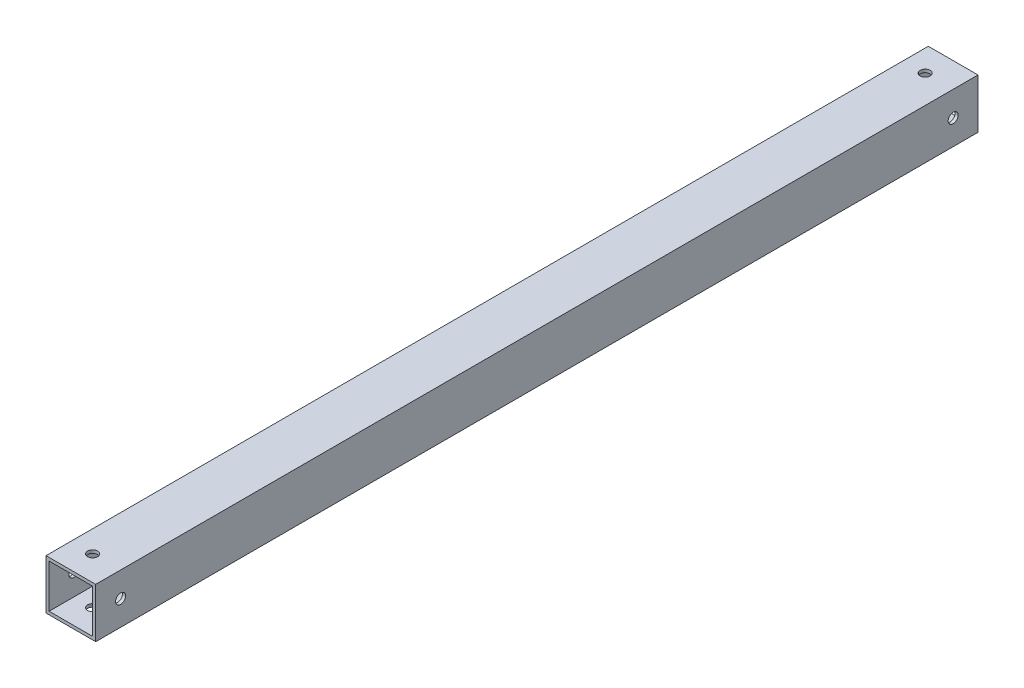
ISO-10303-21;
HEADER;
FILE_DESCRIPTION(('STEP AP214'),'2;1');
FILE_NAME('part.step','',(''),(''),'','','');
FILE_SCHEMA(('AUTOMOTIVE_DESIGN { 1 0 10303 214 1 1 1 1 }'));
ENDSEC;
DATA;
#1=APPLICATION_CONTEXT('core data for automotive mechanical design processes');
#2=APPLICATION_PROTOCOL_DEFINITION('international standard','automotive_design',2000,#1);
#3=PRODUCT_CONTEXT('',#1,'mechanical');
#4=PRODUCT('Part','Part','',(#3));
#5=PRODUCT_RELATED_PRODUCT_CATEGORY('part','',(#4));
#6=PRODUCT_DEFINITION_FORMATION('','',#4);
#7=PRODUCT_DEFINITION_CONTEXT('part definition',#1,'design');
#8=PRODUCT_DEFINITION('design','',#6,#7);
#9=PRODUCT_DEFINITION_SHAPE('','',#8);
#10=(LENGTH_UNIT() NAMED_UNIT(*) SI_UNIT(.MILLI.,.METRE.));
#11=(NAMED_UNIT(*) PLANE_ANGLE_UNIT() SI_UNIT($,.RADIAN.));
#12=(NAMED_UNIT(*) SI_UNIT($,.STERADIAN.) SOLID_ANGLE_UNIT());
#13=UNCERTAINTY_MEASURE_WITH_UNIT(LENGTH_MEASURE(1.E-05),#10,'distance_accuracy_value','');
#14=(GEOMETRIC_REPRESENTATION_CONTEXT(3) GLOBAL_UNCERTAINTY_ASSIGNED_CONTEXT((#13)) GLOBAL_UNIT_ASSIGNED_CONTEXT((#10,
#11,#12)) REPRESENTATION_CONTEXT('',''));
#15=CARTESIAN_POINT('',(0.,0.,0.));
#16=DIRECTION('',(0.,0.,1.));
#17=DIRECTION('',(1.,0.,0.));
#18=AXIS2_PLACEMENT_3D('',#15,#16,#17);
#19=CARTESIAN_POINT('',(0.,0.,450.85));
#20=DIRECTION('',(0.,0.,-1.));
#21=DIRECTION('',(-1.,0.,0.));
#22=AXIS2_PLACEMENT_3D('',#19,#20,#21);
#23=PLANE('',#22);
#24=DIRECTION('',(0.,-1.,0.));
#25=VECTOR('',#24,1.);
#26=CARTESIAN_POINT('',(0.,0.,450.85));
#27=LINE('',#26,#25);
#28=CARTESIAN_POINT('',(0.,25.4,450.85));
#29=VERTEX_POINT('',#28);
#30=CARTESIAN_POINT('',(0.,0.,450.85));
#31=VERTEX_POINT('',#30);
#32=EDGE_CURVE('E156',#29,#31,#27,.T.);
#33=ORIENTED_EDGE('',*,*,#32,.T.);
#34=DIRECTION('',(1.,0.,0.));
#35=VECTOR('',#34,1.);
#36=CARTESIAN_POINT('',(0.,0.,450.85));
#37=LINE('',#36,#35);
#38=CARTESIAN_POINT('',(25.4,0.,450.85));
#39=VERTEX_POINT('',#38);
#40=EDGE_CURVE('E160',#31,#39,#37,.T.);
#41=ORIENTED_EDGE('',*,*,#40,.T.);
#42=DIRECTION('',(0.,1.,0.));
#43=VECTOR('',#42,1.);
#44=CARTESIAN_POINT('',(25.4,0.,450.85));
#45=LINE('',#44,#43);
#46=CARTESIAN_POINT('',(25.4,25.4,450.85));
#47=VERTEX_POINT('',#46);
#48=EDGE_CURVE('E164',#39,#47,#45,.T.);
#49=ORIENTED_EDGE('',*,*,#48,.T.);
#50=DIRECTION('',(-1.,0.,0.));
#51=VECTOR('',#50,1.);
#52=CARTESIAN_POINT('',(0.,25.4,450.85));
#53=LINE('',#52,#51);
#54=EDGE_CURVE('E167',#47,#29,#53,.T.);
#55=ORIENTED_EDGE('',*,*,#54,.T.);
#56=EDGE_LOOP('',(#33,#41,#49,#55));
#57=FACE_BOUND('',#56,.T.);
#58=DIRECTION('',(0.,-1.,0.));
#59=VECTOR('',#58,1.);
#60=CARTESIAN_POINT('',(1.5875,1.5875,450.85));
#61=LINE('',#60,#59);
#62=CARTESIAN_POINT('',(1.5875,23.8125,450.85));
#63=VERTEX_POINT('',#62);
#64=CARTESIAN_POINT('',(1.5875,1.5875,450.85));
#65=VERTEX_POINT('',#64);
#66=EDGE_CURVE('E106',#63,#65,#61,.T.);
#67=ORIENTED_EDGE('',*,*,#66,.F.);
#68=DIRECTION('',(-1.,0.,0.));
#69=VECTOR('',#68,1.);
#70=CARTESIAN_POINT('',(1.5875,23.8125,450.85));
#71=LINE('',#70,#69);
#72=CARTESIAN_POINT('',(23.8125,23.8125,450.85));
#73=VERTEX_POINT('',#72);
#74=EDGE_CURVE('E132',#73,#63,#71,.T.);
#75=ORIENTED_EDGE('',*,*,#74,.F.);
#76=DIRECTION('',(0.,1.,0.));
#77=VECTOR('',#76,1.);
#78=CARTESIAN_POINT('',(23.8125,1.5875,450.85));
#79=LINE('',#78,#77);
#80=CARTESIAN_POINT('',(23.8125,1.5875,450.85));
#81=VERTEX_POINT('',#80);
#82=EDGE_CURVE('E128',#81,#73,#79,.T.);
#83=ORIENTED_EDGE('',*,*,#82,.F.);
#84=DIRECTION('',(1.,0.,0.));
#85=VECTOR('',#84,1.);
#86=CARTESIAN_POINT('',(1.5875,1.5875,450.85));
#87=LINE('',#86,#85);
#88=EDGE_CURVE('E115',#65,#81,#87,.T.);
#89=ORIENTED_EDGE('',*,*,#88,.F.);
#90=EDGE_LOOP('',(#67,#75,#83,#89));
#91=FACE_BOUND('',#90,.T.);
#92=ADVANCED_FACE('F38',(#57,#91),#23,.F.);
#93=CARTESIAN_POINT('',(0.,0.,0.));
#94=DIRECTION('',(0.,0.,-1.));
#95=DIRECTION('',(-1.,0.,0.));
#96=AXIS2_PLACEMENT_3D('',#93,#94,#95);
#97=PLANE('',#96);
#98=DIRECTION('',(0.,-1.,0.));
#99=VECTOR('',#98,1.);
#100=CARTESIAN_POINT('',(0.,0.,0.));
#101=LINE('',#100,#99);
#102=CARTESIAN_POINT('',(0.,25.4,0.));
#103=VERTEX_POINT('',#102);
#104=CARTESIAN_POINT('',(0.,0.,0.));
#105=VERTEX_POINT('',#104);
#106=EDGE_CURVE('E124',#103,#105,#101,.T.);
#107=ORIENTED_EDGE('',*,*,#106,.F.);
#108=DIRECTION('',(-1.,0.,0.));
#109=VECTOR('',#108,1.);
#110=CARTESIAN_POINT('',(0.,25.4,0.));
#111=LINE('',#110,#109);
#112=CARTESIAN_POINT('',(25.4,25.4,0.));
#113=VERTEX_POINT('',#112);
#114=EDGE_CURVE('E161',#113,#103,#111,.T.);
#115=ORIENTED_EDGE('',*,*,#114,.F.);
#116=DIRECTION('',(0.,1.,0.));
#117=VECTOR('',#116,1.);
#118=CARTESIAN_POINT('',(25.4,0.,0.));
#119=LINE('',#118,#117);
#120=CARTESIAN_POINT('',(25.4,0.,0.));
#121=VERTEX_POINT('',#120);
#122=EDGE_CURVE('E177',#121,#113,#119,.T.);
#123=ORIENTED_EDGE('',*,*,#122,.F.);
#124=DIRECTION('',(1.,0.,0.));
#125=VECTOR('',#124,1.);
#126=CARTESIAN_POINT('',(0.,0.,0.));
#127=LINE('',#126,#125);
#128=EDGE_CURVE('E174',#105,#121,#127,.T.);
#129=ORIENTED_EDGE('',*,*,#128,.F.);
#130=EDGE_LOOP('',(#107,#115,#123,#129));
#131=FACE_BOUND('',#130,.T.);
#132=DIRECTION('',(-1.,0.,0.));
#133=VECTOR('',#132,1.);
#134=CARTESIAN_POINT('',(1.5875,23.8125,0.));
#135=LINE('',#134,#133);
#136=CARTESIAN_POINT('',(23.8125,23.8125,0.));
#137=VERTEX_POINT('',#136);
#138=CARTESIAN_POINT('',(1.5875,23.8125,0.));
#139=VERTEX_POINT('',#138);
#140=EDGE_CURVE('E116',#137,#139,#135,.T.);
#141=ORIENTED_EDGE('',*,*,#140,.T.);
#142=DIRECTION('',(0.,-1.,0.));
#143=VECTOR('',#142,1.);
#144=CARTESIAN_POINT('',(1.5875,1.5875,0.));
#145=LINE('',#144,#143);
#146=CARTESIAN_POINT('',(1.5875,1.5875,0.));
#147=VERTEX_POINT('',#146);
#148=EDGE_CURVE('E64',#139,#147,#145,.T.);
#149=ORIENTED_EDGE('',*,*,#148,.T.);
#150=DIRECTION('',(1.,0.,0.));
#151=VECTOR('',#150,1.);
#152=CARTESIAN_POINT('',(1.5875,1.5875,0.));
#153=LINE('',#152,#151);
#154=CARTESIAN_POINT('',(23.8125,1.5875,0.));
#155=VERTEX_POINT('',#154);
#156=EDGE_CURVE('E122',#147,#155,#153,.T.);
#157=ORIENTED_EDGE('',*,*,#156,.T.);
#158=DIRECTION('',(0.,1.,0.));
#159=VECTOR('',#158,1.);
#160=CARTESIAN_POINT('',(23.8125,1.5875,0.));
#161=LINE('',#160,#159);
#162=EDGE_CURVE('E143',#155,#137,#161,.T.);
#163=ORIENTED_EDGE('',*,*,#162,.T.);
#164=EDGE_LOOP('',(#141,#149,#157,#163));
#165=FACE_BOUND('',#164,.T.);
#166=ADVANCED_FACE('F274',(#131,#165),#97,.T.);
#167=CARTESIAN_POINT('',(0.,0.,450.85));
#168=DIRECTION('',(1.,0.,0.));
#169=DIRECTION('',(0.,0.,-1.));
#170=AXIS2_PLACEMENT_3D('',#167,#168,#169);
#171=PLANE('',#170);
#172=CARTESIAN_POINT('',(0.,12.7,438.15));
#173=DIRECTION('',(1.,0.,0.));
#174=DIRECTION('',(0.,0.,-1.));
#175=AXIS2_PLACEMENT_3D('',#172,#173,#174);
#176=CIRCLE('',#175,2.54000000000001);
#177=CARTESIAN_POINT('',(0.,12.7,435.61));
#178=VERTEX_POINT('',#177);
#179=EDGE_CURVE('E197',#178,#178,#176,.T.);
#180=ORIENTED_EDGE('',*,*,#179,.T.);
#181=EDGE_LOOP('',(#180));
#182=FACE_BOUND('',#181,.T.);
#183=CARTESIAN_POINT('',(0.,12.7,12.7));
#184=DIRECTION('',(1.,0.,0.));
#185=DIRECTION('',(0.,0.,1.));
#186=AXIS2_PLACEMENT_3D('',#183,#184,#185);
#187=CIRCLE('',#186,2.53999999999998);
#188=CARTESIAN_POINT('',(0.,12.7,15.24));
#189=VERTEX_POINT('',#188);
#190=EDGE_CURVE('E241',#189,#189,#187,.T.);
#191=ORIENTED_EDGE('',*,*,#190,.T.);
#192=EDGE_LOOP('',(#191));
#193=FACE_BOUND('',#192,.T.);
#194=ORIENTED_EDGE('',*,*,#106,.T.);
#195=DIRECTION('',(0.,0.,-1.));
#196=VECTOR('',#195,1.);
#197=CARTESIAN_POINT('',(0.,0.,450.85));
#198=LINE('',#197,#196);
#199=EDGE_CURVE('E11',#31,#105,#198,.T.);
#200=ORIENTED_EDGE('',*,*,#199,.F.);
#201=ORIENTED_EDGE('',*,*,#32,.F.);
#202=DIRECTION('',(0.,0.,-1.));
#203=VECTOR('',#202,1.);
#204=CARTESIAN_POINT('',(0.,25.4,450.85));
#205=LINE('',#204,#203);
#206=EDGE_CURVE('E170',#29,#103,#205,.T.);
#207=ORIENTED_EDGE('',*,*,#206,.T.);
#208=EDGE_LOOP('',(#194,#200,#201,#207));
#209=FACE_BOUND('',#208,.T.);
#210=ADVANCED_FACE('F40',(#182,#193,#209),#171,.F.);
#211=CARTESIAN_POINT('',(0.,0.,450.85));
#212=DIRECTION('',(0.,1.,0.));
#213=DIRECTION('',(0.,0.,1.));
#214=AXIS2_PLACEMENT_3D('',#211,#212,#213);
#215=PLANE('',#214);
#216=CARTESIAN_POINT('',(11.1124999999999,0.,438.15));
#217=DIRECTION('',(0.,-1.,0.));
#218=DIRECTION('',(0.,0.,-1.));
#219=AXIS2_PLACEMENT_3D('',#216,#217,#218);
#220=CIRCLE('',#219,2.54000000000001);
#221=CARTESIAN_POINT('',(11.1124999999999,0.,435.61));
#222=VERTEX_POINT('',#221);
#223=EDGE_CURVE('E213',#222,#222,#220,.T.);
#224=ORIENTED_EDGE('',*,*,#223,.F.);
#225=EDGE_LOOP('',(#224));
#226=FACE_BOUND('',#225,.T.);
#227=CARTESIAN_POINT('',(11.1125,0.,12.7));
#228=DIRECTION('',(0.,-1.,0.));
#229=DIRECTION('',(0.,0.,1.));
#230=AXIS2_PLACEMENT_3D('',#227,#228,#229);
#231=CIRCLE('',#230,2.54000000000001);
#232=CARTESIAN_POINT('',(11.1125,0.,15.24));
#233=VERTEX_POINT('',#232);
#234=EDGE_CURVE('E225',#233,#233,#231,.T.);
#235=ORIENTED_EDGE('',*,*,#234,.F.);
#236=EDGE_LOOP('',(#235));
#237=FACE_BOUND('',#236,.T.);
#238=ORIENTED_EDGE('',*,*,#128,.T.);
#239=DIRECTION('',(0.,0.,-1.));
#240=VECTOR('',#239,1.);
#241=CARTESIAN_POINT('',(25.4,0.,450.85));
#242=LINE('',#241,#240);
#243=EDGE_CURVE('E48',#39,#121,#242,.T.);
#244=ORIENTED_EDGE('',*,*,#243,.F.);
#245=ORIENTED_EDGE('',*,*,#40,.F.);
#246=ORIENTED_EDGE('',*,*,#199,.T.);
#247=EDGE_LOOP('',(#238,#244,#245,#246));
#248=FACE_BOUND('',#247,.T.);
#249=ADVANCED_FACE('F273',(#226,#237,#248),#215,.F.);
#250=CARTESIAN_POINT('',(25.4,0.,450.85));
#251=DIRECTION('',(-1.,0.,0.));
#252=DIRECTION('',(0.,0.,1.));
#253=AXIS2_PLACEMENT_3D('',#250,#251,#252);
#254=PLANE('',#253);
#255=CARTESIAN_POINT('',(25.4,12.7,438.15));
#256=DIRECTION('',(1.,0.,0.));
#257=DIRECTION('',(0.,0.,-1.));
#258=AXIS2_PLACEMENT_3D('',#255,#256,#257);
#259=CIRCLE('',#258,2.54000000000001);
#260=CARTESIAN_POINT('',(25.4,12.7,435.61));
#261=VERTEX_POINT('',#260);
#262=EDGE_CURVE('E237',#261,#261,#259,.T.);
#263=ORIENTED_EDGE('',*,*,#262,.F.);
#264=EDGE_LOOP('',(#263));
#265=FACE_BOUND('',#264,.T.);
#266=CARTESIAN_POINT('',(25.4,12.7,12.7));
#267=DIRECTION('',(1.,0.,0.));
#268=DIRECTION('',(0.,0.,1.));
#269=AXIS2_PLACEMENT_3D('',#266,#267,#268);
#270=CIRCLE('',#269,2.53999999999998);
#271=CARTESIAN_POINT('',(25.4,12.7,15.24));
#272=VERTEX_POINT('',#271);
#273=EDGE_CURVE('E233',#272,#272,#270,.T.);
#274=ORIENTED_EDGE('',*,*,#273,.F.);
#275=EDGE_LOOP('',(#274));
#276=FACE_BOUND('',#275,.T.);
#277=ORIENTED_EDGE('',*,*,#122,.T.);
#278=DIRECTION('',(0.,0.,-1.));
#279=VECTOR('',#278,1.);
#280=CARTESIAN_POINT('',(25.4,25.4,450.85));
#281=LINE('',#280,#279);
#282=EDGE_CURVE('E185',#47,#113,#281,.T.);
#283=ORIENTED_EDGE('',*,*,#282,.F.);
#284=ORIENTED_EDGE('',*,*,#48,.F.);
#285=ORIENTED_EDGE('',*,*,#243,.T.);
#286=EDGE_LOOP('',(#277,#283,#284,#285));
#287=FACE_BOUND('',#286,.T.);
#288=ADVANCED_FACE('F292',(#265,#276,#287),#254,.F.);
#289=CARTESIAN_POINT('',(0.,25.4,450.85));
#290=DIRECTION('',(0.,-1.,0.));
#291=DIRECTION('',(0.,0.,-1.));
#292=AXIS2_PLACEMENT_3D('',#289,#290,#291);
#293=PLANE('',#292);
#294=CARTESIAN_POINT('',(11.1124999999999,25.4,438.15));
#295=DIRECTION('',(0.,-1.,0.));
#296=DIRECTION('',(0.,0.,-1.));
#297=AXIS2_PLACEMENT_3D('',#294,#295,#296);
#298=CIRCLE('',#297,2.54000000000001);
#299=CARTESIAN_POINT('',(11.1124999999999,25.4,435.61));
#300=VERTEX_POINT('',#299);
#301=EDGE_CURVE('E205',#300,#300,#298,.T.);
#302=ORIENTED_EDGE('',*,*,#301,.T.);
#303=EDGE_LOOP('',(#302));
#304=FACE_BOUND('',#303,.T.);
#305=CARTESIAN_POINT('',(11.1125,25.4,12.7));
#306=DIRECTION('',(0.,-1.,0.));
#307=DIRECTION('',(0.,0.,1.));
#308=AXIS2_PLACEMENT_3D('',#305,#306,#307);
#309=CIRCLE('',#308,2.54000000000001);
#310=CARTESIAN_POINT('',(11.1125,25.4,15.24));
#311=VERTEX_POINT('',#310);
#312=EDGE_CURVE('E219',#311,#311,#309,.T.);
#313=ORIENTED_EDGE('',*,*,#312,.T.);
#314=EDGE_LOOP('',(#313));
#315=FACE_BOUND('',#314,.T.);
#316=ORIENTED_EDGE('',*,*,#114,.T.);
#317=ORIENTED_EDGE('',*,*,#206,.F.);
#318=ORIENTED_EDGE('',*,*,#54,.F.);
#319=ORIENTED_EDGE('',*,*,#282,.T.);
#320=EDGE_LOOP('',(#316,#317,#318,#319));
#321=FACE_BOUND('',#320,.T.);
#322=ADVANCED_FACE('F259',(#304,#315,#321),#293,.F.);
#323=CARTESIAN_POINT('',(1.5875,1.5875,450.85));
#324=DIRECTION('',(1.,0.,0.));
#325=DIRECTION('',(0.,0.,-1.));
#326=AXIS2_PLACEMENT_3D('',#323,#324,#325);
#327=PLANE('',#326);
#328=CARTESIAN_POINT('',(1.5875,12.7,438.15));
#329=DIRECTION('',(1.,0.,0.));
#330=DIRECTION('',(0.,0.,-1.));
#331=AXIS2_PLACEMENT_3D('',#328,#329,#330);
#332=CIRCLE('',#331,2.54000000000001);
#333=CARTESIAN_POINT('',(1.5875,12.7,435.61));
#334=VERTEX_POINT('',#333);
#335=EDGE_CURVE('E140',#334,#334,#332,.T.);
#336=ORIENTED_EDGE('',*,*,#335,.F.);
#337=EDGE_LOOP('',(#336));
#338=FACE_BOUND('',#337,.T.);
#339=CARTESIAN_POINT('',(1.5875,12.7,12.7));
#340=DIRECTION('',(1.,0.,0.));
#341=DIRECTION('',(0.,0.,-1.));
#342=AXIS2_PLACEMENT_3D('',#339,#340,#341);
#343=CIRCLE('',#342,2.53999999999998);
#344=CARTESIAN_POINT('',(1.5875,12.7,10.16));
#345=VERTEX_POINT('',#344);
#346=EDGE_CURVE('E196',#345,#345,#343,.T.);
#347=ORIENTED_EDGE('',*,*,#346,.F.);
#348=EDGE_LOOP('',(#347));
#349=FACE_BOUND('',#348,.T.);
#350=ORIENTED_EDGE('',*,*,#148,.F.);
#351=DIRECTION('',(0.,0.,-1.));
#352=VECTOR('',#351,1.);
#353=CARTESIAN_POINT('',(1.5875,23.8125,450.85));
#354=LINE('',#353,#352);
#355=EDGE_CURVE('E110',#63,#139,#354,.T.);
#356=ORIENTED_EDGE('',*,*,#355,.F.);
#357=ORIENTED_EDGE('',*,*,#66,.T.);
#358=DIRECTION('',(0.,0.,-1.));
#359=VECTOR('',#358,1.);
#360=CARTESIAN_POINT('',(1.5875,1.5875,450.85));
#361=LINE('',#360,#359);
#362=EDGE_CURVE('E109',#65,#147,#361,.T.);
#363=ORIENTED_EDGE('',*,*,#362,.T.);
#364=EDGE_LOOP('',(#350,#356,#357,#363));
#365=FACE_BOUND('',#364,.T.);
#366=ADVANCED_FACE('F108',(#338,#349,#365),#327,.T.);
#367=CARTESIAN_POINT('',(1.5875,1.5875,450.85));
#368=DIRECTION('',(0.,1.,0.));
#369=DIRECTION('',(0.,0.,1.));
#370=AXIS2_PLACEMENT_3D('',#367,#368,#369);
#371=PLANE('',#370);
#372=CARTESIAN_POINT('',(11.1124999999999,1.5875,438.15));
#373=DIRECTION('',(0.,1.,0.));
#374=DIRECTION('',(0.,0.,1.));
#375=AXIS2_PLACEMENT_3D('',#372,#373,#374);
#376=CIRCLE('',#375,2.54000000000001);
#377=CARTESIAN_POINT('',(11.1124999999999,1.5875,440.69));
#378=VERTEX_POINT('',#377);
#379=EDGE_CURVE('E229',#378,#378,#376,.T.);
#380=ORIENTED_EDGE('',*,*,#379,.F.);
#381=EDGE_LOOP('',(#380));
#382=FACE_BOUND('',#381,.T.);
#383=CARTESIAN_POINT('',(11.1125,1.5875,12.7));
#384=DIRECTION('',(0.,1.,0.));
#385=DIRECTION('',(0.,0.,1.));
#386=AXIS2_PLACEMENT_3D('',#383,#384,#385);
#387=CIRCLE('',#386,2.54000000000001);
#388=CARTESIAN_POINT('',(11.1125,1.5875,15.24));
#389=VERTEX_POINT('',#388);
#390=EDGE_CURVE('E204',#389,#389,#387,.T.);
#391=ORIENTED_EDGE('',*,*,#390,.F.);
#392=EDGE_LOOP('',(#391));
#393=FACE_BOUND('',#392,.T.);
#394=ORIENTED_EDGE('',*,*,#156,.F.);
#395=ORIENTED_EDGE('',*,*,#362,.F.);
#396=ORIENTED_EDGE('',*,*,#88,.T.);
#397=DIRECTION('',(0.,0.,-1.));
#398=VECTOR('',#397,1.);
#399=CARTESIAN_POINT('',(23.8125,1.5875,450.85));
#400=LINE('',#399,#398);
#401=EDGE_CURVE('E125',#81,#155,#400,.T.);
#402=ORIENTED_EDGE('',*,*,#401,.T.);
#403=EDGE_LOOP('',(#394,#395,#396,#402));
#404=FACE_BOUND('',#403,.T.);
#405=ADVANCED_FACE('F119',(#382,#393,#404),#371,.T.);
#406=CARTESIAN_POINT('',(23.8125,1.5875,450.85));
#407=DIRECTION('',(-1.,0.,0.));
#408=DIRECTION('',(0.,0.,1.));
#409=AXIS2_PLACEMENT_3D('',#406,#407,#408);
#410=PLANE('',#409);
#411=CARTESIAN_POINT('',(23.8125,12.7,438.15));
#412=DIRECTION('',(-1.,0.,0.));
#413=DIRECTION('',(0.,0.,1.));
#414=AXIS2_PLACEMENT_3D('',#411,#412,#413);
#415=CIRCLE('',#414,2.54000000000001);
#416=CARTESIAN_POINT('',(23.8125,12.7,440.69));
#417=VERTEX_POINT('',#416);
#418=EDGE_CURVE('E198',#417,#417,#415,.T.);
#419=ORIENTED_EDGE('',*,*,#418,.F.);
#420=EDGE_LOOP('',(#419));
#421=FACE_BOUND('',#420,.T.);
#422=CARTESIAN_POINT('',(23.8125,12.7,12.7));
#423=DIRECTION('',(-1.,0.,0.));
#424=DIRECTION('',(0.,0.,1.));
#425=AXIS2_PLACEMENT_3D('',#422,#423,#424);
#426=CIRCLE('',#425,2.53999999999998);
#427=CARTESIAN_POINT('',(23.8125,12.7,15.24));
#428=VERTEX_POINT('',#427);
#429=EDGE_CURVE('E192',#428,#428,#426,.T.);
#430=ORIENTED_EDGE('',*,*,#429,.F.);
#431=EDGE_LOOP('',(#430));
#432=FACE_BOUND('',#431,.T.);
#433=ORIENTED_EDGE('',*,*,#162,.F.);
#434=ORIENTED_EDGE('',*,*,#401,.F.);
#435=ORIENTED_EDGE('',*,*,#82,.T.);
#436=DIRECTION('',(0.,0.,-1.));
#437=VECTOR('',#436,1.);
#438=CARTESIAN_POINT('',(23.8125,23.8125,450.85));
#439=LINE('',#438,#437);
#440=EDGE_CURVE('E56',#73,#137,#439,.T.);
#441=ORIENTED_EDGE('',*,*,#440,.T.);
#442=EDGE_LOOP('',(#433,#434,#435,#441));
#443=FACE_BOUND('',#442,.T.);
#444=ADVANCED_FACE('F313',(#421,#432,#443),#410,.T.);
#445=CARTESIAN_POINT('',(1.5875,23.8125,450.85));
#446=DIRECTION('',(0.,-1.,0.));
#447=DIRECTION('',(0.,0.,-1.));
#448=AXIS2_PLACEMENT_3D('',#445,#446,#447);
#449=PLANE('',#448);
#450=CARTESIAN_POINT('',(11.1124999999999,23.8125,438.15));
#451=DIRECTION('',(0.,-1.,0.));
#452=DIRECTION('',(0.,0.,-1.));
#453=AXIS2_PLACEMENT_3D('',#450,#451,#452);
#454=CIRCLE('',#453,2.54000000000001);
#455=CARTESIAN_POINT('',(11.1124999999999,23.8125,435.61));
#456=VERTEX_POINT('',#455);
#457=EDGE_CURVE('E42',#456,#456,#454,.T.);
#458=ORIENTED_EDGE('',*,*,#457,.F.);
#459=EDGE_LOOP('',(#458));
#460=FACE_BOUND('',#459,.T.);
#461=CARTESIAN_POINT('',(11.1125,23.8125,12.7));
#462=DIRECTION('',(0.,-1.,0.));
#463=DIRECTION('',(0.,0.,-1.));
#464=AXIS2_PLACEMENT_3D('',#461,#462,#463);
#465=CIRCLE('',#464,2.54000000000001);
#466=CARTESIAN_POINT('',(11.1125,23.8125,10.16));
#467=VERTEX_POINT('',#466);
#468=EDGE_CURVE('E201',#467,#467,#465,.T.);
#469=ORIENTED_EDGE('',*,*,#468,.F.);
#470=EDGE_LOOP('',(#469));
#471=FACE_BOUND('',#470,.T.);
#472=ORIENTED_EDGE('',*,*,#140,.F.);
#473=ORIENTED_EDGE('',*,*,#440,.F.);
#474=ORIENTED_EDGE('',*,*,#74,.T.);
#475=ORIENTED_EDGE('',*,*,#355,.T.);
#476=EDGE_LOOP('',(#472,#473,#474,#475));
#477=FACE_BOUND('',#476,.T.);
#478=ADVANCED_FACE('F317',(#460,#471,#477),#449,.T.);
#479=CARTESIAN_POINT('',(0.,12.7,12.7));
#480=DIRECTION('',(1.,0.,0.));
#481=DIRECTION('',(0.,0.,-1.));
#482=AXIS2_PLACEMENT_3D('',#479,#480,#481);
#483=CYLINDRICAL_SURFACE('',#482,2.53999999999998);
#484=ORIENTED_EDGE('',*,*,#429,.T.);
#485=EDGE_LOOP('',(#484));
#486=FACE_BOUND('',#485,.T.);
#487=ORIENTED_EDGE('',*,*,#273,.T.);
#488=EDGE_LOOP('',(#487));
#489=FACE_BOUND('',#488,.T.);
#490=ADVANCED_FACE('F268',(#486,#489),#483,.F.);
#491=CARTESIAN_POINT('',(0.,12.7,438.15));
#492=DIRECTION('',(1.,0.,0.));
#493=DIRECTION('',(0.,0.,-1.));
#494=AXIS2_PLACEMENT_3D('',#491,#492,#493);
#495=CYLINDRICAL_SURFACE('',#494,2.54000000000001);
#496=ORIENTED_EDGE('',*,*,#418,.T.);
#497=EDGE_LOOP('',(#496));
#498=FACE_BOUND('',#497,.T.);
#499=ORIENTED_EDGE('',*,*,#262,.T.);
#500=EDGE_LOOP('',(#499));
#501=FACE_BOUND('',#500,.T.);
#502=ADVANCED_FACE('F266',(#498,#501),#495,.F.);
#503=ORIENTED_EDGE('',*,*,#346,.T.);
#504=EDGE_LOOP('',(#503));
#505=FACE_BOUND('',#504,.T.);
#506=ORIENTED_EDGE('',*,*,#190,.F.);
#507=EDGE_LOOP('',(#506));
#508=FACE_BOUND('',#507,.T.);
#509=ADVANCED_FACE('F263',(#505,#508),#483,.F.);
#510=ORIENTED_EDGE('',*,*,#335,.T.);
#511=EDGE_LOOP('',(#510));
#512=FACE_BOUND('',#511,.T.);
#513=ORIENTED_EDGE('',*,*,#179,.F.);
#514=EDGE_LOOP('',(#513));
#515=FACE_BOUND('',#514,.T.);
#516=ADVANCED_FACE('F254',(#512,#515),#495,.F.);
#517=CARTESIAN_POINT('',(11.1125,25.4,12.7));
#518=DIRECTION('',(0.,-1.,0.));
#519=DIRECTION('',(0.,0.,-1.));
#520=AXIS2_PLACEMENT_3D('',#517,#518,#519);
#521=CYLINDRICAL_SURFACE('',#520,2.54000000000001);
#522=ORIENTED_EDGE('',*,*,#468,.T.);
#523=EDGE_LOOP('',(#522));
#524=FACE_BOUND('',#523,.T.);
#525=ORIENTED_EDGE('',*,*,#312,.F.);
#526=EDGE_LOOP('',(#525));
#527=FACE_BOUND('',#526,.T.);
#528=ADVANCED_FACE('F327',(#524,#527),#521,.F.);
#529=CARTESIAN_POINT('',(11.1124999999999,25.4,438.15));
#530=DIRECTION('',(0.,-1.,0.));
#531=DIRECTION('',(0.,0.,-1.));
#532=AXIS2_PLACEMENT_3D('',#529,#530,#531);
#533=CYLINDRICAL_SURFACE('',#532,2.54000000000001);
#534=ORIENTED_EDGE('',*,*,#457,.T.);
#535=EDGE_LOOP('',(#534));
#536=FACE_BOUND('',#535,.T.);
#537=ORIENTED_EDGE('',*,*,#301,.F.);
#538=EDGE_LOOP('',(#537));
#539=FACE_BOUND('',#538,.T.);
#540=ADVANCED_FACE('F330',(#536,#539),#533,.F.);
#541=ORIENTED_EDGE('',*,*,#390,.T.);
#542=EDGE_LOOP('',(#541));
#543=FACE_BOUND('',#542,.T.);
#544=ORIENTED_EDGE('',*,*,#234,.T.);
#545=EDGE_LOOP('',(#544));
#546=FACE_BOUND('',#545,.T.);
#547=ADVANCED_FACE('F331',(#543,#546),#521,.F.);
#548=ORIENTED_EDGE('',*,*,#379,.T.);
#549=EDGE_LOOP('',(#548));
#550=FACE_BOUND('',#549,.T.);
#551=ORIENTED_EDGE('',*,*,#223,.T.);
#552=EDGE_LOOP('',(#551));
#553=FACE_BOUND('',#552,.T.);
#554=ADVANCED_FACE('F334',(#550,#553),#533,.F.);
#555=CLOSED_SHELL('',(#92,#166,#210,#249,#288,#322,#366,#405,#444,#478,#490,#502,#509,#516,#528,
#540,#547,#554));
#556=MANIFOLD_SOLID_BREP('B2',#555);
#557=ADVANCED_BREP_SHAPE_REPRESENTATION('',(#18,#556),#14);
#558=SHAPE_DEFINITION_REPRESENTATION(#9,#557);
ENDSEC;
END-ISO-10303-21;
